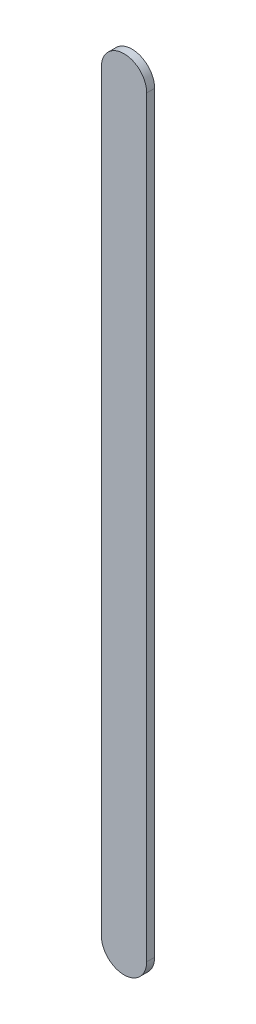
ISO-10303-21;
HEADER;
FILE_DESCRIPTION(('STEP AP214'),'2;1');
FILE_NAME('part.step','',(''),(''),'','','');
FILE_SCHEMA(('AUTOMOTIVE_DESIGN { 1 0 10303 214 1 1 1 1 }'));
ENDSEC;
DATA;
#1=APPLICATION_CONTEXT('core data for automotive mechanical design processes');
#2=APPLICATION_PROTOCOL_DEFINITION('international standard','automotive_design',2000,#1);
#3=PRODUCT_CONTEXT('',#1,'mechanical');
#4=PRODUCT('Part','Part','',(#3));
#5=PRODUCT_RELATED_PRODUCT_CATEGORY('part','',(#4));
#6=PRODUCT_DEFINITION_FORMATION('','',#4);
#7=PRODUCT_DEFINITION_CONTEXT('part definition',#1,'design');
#8=PRODUCT_DEFINITION('design','',#6,#7);
#9=PRODUCT_DEFINITION_SHAPE('','',#8);
#10=(LENGTH_UNIT() NAMED_UNIT(*) SI_UNIT(.MILLI.,.METRE.));
#11=(NAMED_UNIT(*) PLANE_ANGLE_UNIT() SI_UNIT($,.RADIAN.));
#12=(NAMED_UNIT(*) SI_UNIT($,.STERADIAN.) SOLID_ANGLE_UNIT());
#13=UNCERTAINTY_MEASURE_WITH_UNIT(LENGTH_MEASURE(1.E-05),#10,'distance_accuracy_value','');
#14=(GEOMETRIC_REPRESENTATION_CONTEXT(3) GLOBAL_UNCERTAINTY_ASSIGNED_CONTEXT((#13)) GLOBAL_UNIT_ASSIGNED_CONTEXT((#10,
#11,#12)) REPRESENTATION_CONTEXT('',''));
#15=CARTESIAN_POINT('',(0.,0.,0.));
#16=DIRECTION('',(0.,0.,1.));
#17=DIRECTION('',(1.,0.,0.));
#18=AXIS2_PLACEMENT_3D('',#15,#16,#17);
#19=CARTESIAN_POINT('',(93.,-119.905026,1.635));
#20=DIRECTION('',(0.,0.,1.));
#21=DIRECTION('',(1.,0.,0.));
#22=AXIS2_PLACEMENT_3D('',#19,#20,#21);
#23=PLANE('',#22);
#24=DIRECTION('',(0.,-1.,0.));
#25=VECTOR('',#24,1.);
#26=CARTESIAN_POINT('',(93.,-119.905026,1.635));
#27=LINE('',#26,#25);
#28=CARTESIAN_POINT('',(93.,-119.905026,1.635));
#29=VERTEX_POINT('',#28);
#30=CARTESIAN_POINT('',(93.,-123.225127,1.635));
#31=VERTEX_POINT('',#30);
#32=EDGE_CURVE('E79',#29,#31,#27,.T.);
#33=ORIENTED_EDGE('',*,*,#32,.T.);
#34=CARTESIAN_POINT('',(93.1,-123.225127,1.635));
#35=DIRECTION('',(0.,0.,1.));
#36=DIRECTION('',(-1.,-1.42108547152E-13,0.));
#37=AXIS2_PLACEMENT_3D('',#34,#35,#36);
#38=CIRCLE('',#37,0.1);
#39=CARTESIAN_POINT('',(93.2,-123.225127,1.635));
#40=VERTEX_POINT('',#39);
#41=EDGE_CURVE('E97',#31,#40,#38,.T.);
#42=ORIENTED_EDGE('',*,*,#41,.T.);
#43=DIRECTION('',(0.,1.,0.));
#44=VECTOR('',#43,1.);
#45=CARTESIAN_POINT('',(93.2,-123.225127,1.635));
#46=LINE('',#45,#44);
#47=CARTESIAN_POINT('',(93.2,-119.905026,1.635));
#48=VERTEX_POINT('',#47);
#49=EDGE_CURVE('E72',#40,#48,#46,.T.);
#50=ORIENTED_EDGE('',*,*,#49,.T.);
#51=CARTESIAN_POINT('',(93.1,-119.905026,1.635));
#52=DIRECTION('',(0.,0.,1.));
#53=DIRECTION('',(1.,0.,0.));
#54=AXIS2_PLACEMENT_3D('',#51,#52,#53);
#55=CIRCLE('',#54,0.1);
#56=EDGE_CURVE('E11',#48,#29,#55,.T.);
#57=ORIENTED_EDGE('',*,*,#56,.T.);
#58=EDGE_LOOP('',(#33,#42,#50,#57));
#59=FACE_BOUND('',#58,.T.);
#60=ADVANCED_FACE('F17',(#59),#23,.T.);
#61=CARTESIAN_POINT('',(93.,-119.905026,1.6));
#62=DIRECTION('',(0.,0.,1.));
#63=DIRECTION('',(1.,0.,0.));
#64=AXIS2_PLACEMENT_3D('',#61,#62,#63);
#65=PLANE('',#64);
#66=CARTESIAN_POINT('',(93.1,-119.905026,1.6));
#67=DIRECTION('',(0.,0.,1.));
#68=DIRECTION('',(1.,0.,0.));
#69=AXIS2_PLACEMENT_3D('',#66,#67,#68);
#70=CIRCLE('',#69,0.1);
#71=CARTESIAN_POINT('',(93.2,-119.905026,1.6));
#72=VERTEX_POINT('',#71);
#73=CARTESIAN_POINT('',(93.,-119.905026,1.6));
#74=VERTEX_POINT('',#73);
#75=EDGE_CURVE('E26',#72,#74,#70,.T.);
#76=ORIENTED_EDGE('',*,*,#75,.F.);
#77=DIRECTION('',(0.,1.,0.));
#78=VECTOR('',#77,1.);
#79=CARTESIAN_POINT('',(93.2,-123.225127,1.6));
#80=LINE('',#79,#78);
#81=CARTESIAN_POINT('',(93.2,-123.225127,1.6));
#82=VERTEX_POINT('',#81);
#83=EDGE_CURVE('E95',#82,#72,#80,.T.);
#84=ORIENTED_EDGE('',*,*,#83,.F.);
#85=CARTESIAN_POINT('',(93.1,-123.225127,1.6));
#86=DIRECTION('',(0.,0.,1.));
#87=DIRECTION('',(-1.,-1.42108547152E-13,0.));
#88=AXIS2_PLACEMENT_3D('',#85,#86,#87);
#89=CIRCLE('',#88,0.1);
#90=CARTESIAN_POINT('',(93.,-123.225127,1.6));
#91=VERTEX_POINT('',#90);
#92=EDGE_CURVE('E81',#91,#82,#89,.T.);
#93=ORIENTED_EDGE('',*,*,#92,.F.);
#94=DIRECTION('',(0.,-1.,0.));
#95=VECTOR('',#94,1.);
#96=CARTESIAN_POINT('',(93.,-119.905026,1.6));
#97=LINE('',#96,#95);
#98=EDGE_CURVE('E77',#74,#91,#97,.T.);
#99=ORIENTED_EDGE('',*,*,#98,.F.);
#100=EDGE_LOOP('',(#76,#84,#93,#99));
#101=FACE_BOUND('',#100,.T.);
#102=ADVANCED_FACE('F83',(#101),#65,.F.);
#103=CARTESIAN_POINT('',(93.1,-119.905026,1.6));
#104=DIRECTION('',(0.,0.,-1.));
#105=DIRECTION('',(1.,0.,0.));
#106=AXIS2_PLACEMENT_3D('',#103,#104,#105);
#107=CYLINDRICAL_SURFACE('',#106,0.1);
#108=ORIENTED_EDGE('',*,*,#75,.T.);
#109=DIRECTION('',(0.,0.,1.));
#110=VECTOR('',#109,1.);
#111=CARTESIAN_POINT('',(93.,-119.905026,1.6));
#112=LINE('',#111,#110);
#113=EDGE_CURVE('E64',#74,#29,#112,.T.);
#114=ORIENTED_EDGE('',*,*,#113,.T.);
#115=ORIENTED_EDGE('',*,*,#56,.F.);
#116=DIRECTION('',(0.,0.,1.));
#117=VECTOR('',#116,1.);
#118=CARTESIAN_POINT('',(93.2,-119.905026,1.6));
#119=LINE('',#118,#117);
#120=EDGE_CURVE('E67',#72,#48,#119,.T.);
#121=ORIENTED_EDGE('',*,*,#120,.F.);
#122=EDGE_LOOP('',(#108,#114,#115,#121));
#123=FACE_BOUND('',#122,.T.);
#124=ADVANCED_FACE('F63',(#123),#107,.T.);
#125=CARTESIAN_POINT('',(93.2,-123.225127,1.6));
#126=DIRECTION('',(-1.,0.,0.));
#127=DIRECTION('',(0.,0.,1.));
#128=AXIS2_PLACEMENT_3D('',#125,#126,#127);
#129=PLANE('',#128);
#130=ORIENTED_EDGE('',*,*,#83,.T.);
#131=ORIENTED_EDGE('',*,*,#120,.T.);
#132=ORIENTED_EDGE('',*,*,#49,.F.);
#133=DIRECTION('',(0.,0.,1.));
#134=VECTOR('',#133,1.);
#135=CARTESIAN_POINT('',(93.2,-123.225127,1.6));
#136=LINE('',#135,#134);
#137=EDGE_CURVE('E103',#82,#40,#136,.T.);
#138=ORIENTED_EDGE('',*,*,#137,.F.);
#139=EDGE_LOOP('',(#130,#131,#132,#138));
#140=FACE_BOUND('',#139,.T.);
#141=ADVANCED_FACE('F118',(#140),#129,.F.);
#142=CARTESIAN_POINT('',(93.1,-123.225127,1.6));
#143=DIRECTION('',(0.,0.,-1.));
#144=DIRECTION('',(-1.,-1.42108547152E-13,0.));
#145=AXIS2_PLACEMENT_3D('',#142,#143,#144);
#146=CYLINDRICAL_SURFACE('',#145,0.1);
#147=ORIENTED_EDGE('',*,*,#92,.T.);
#148=ORIENTED_EDGE('',*,*,#137,.T.);
#149=ORIENTED_EDGE('',*,*,#41,.F.);
#150=DIRECTION('',(0.,0.,1.));
#151=VECTOR('',#150,1.);
#152=CARTESIAN_POINT('',(93.,-123.225127,1.6));
#153=LINE('',#152,#151);
#154=EDGE_CURVE('E87',#91,#31,#153,.T.);
#155=ORIENTED_EDGE('',*,*,#154,.F.);
#156=EDGE_LOOP('',(#147,#148,#149,#155));
#157=FACE_BOUND('',#156,.T.);
#158=ADVANCED_FACE('F120',(#157),#146,.T.);
#159=CARTESIAN_POINT('',(93.,-119.905026,1.6));
#160=DIRECTION('',(1.,0.,0.));
#161=DIRECTION('',(0.,1.,0.));
#162=AXIS2_PLACEMENT_3D('',#159,#160,#161);
#163=PLANE('',#162);
#164=ORIENTED_EDGE('',*,*,#98,.T.);
#165=ORIENTED_EDGE('',*,*,#154,.T.);
#166=ORIENTED_EDGE('',*,*,#32,.F.);
#167=ORIENTED_EDGE('',*,*,#113,.F.);
#168=EDGE_LOOP('',(#164,#165,#166,#167));
#169=FACE_BOUND('',#168,.T.);
#170=ADVANCED_FACE('F75',(#169),#163,.F.);
#171=CLOSED_SHELL('',(#60,#102,#124,#141,#158,#170));
#172=MANIFOLD_SOLID_BREP('B1',#171);
#173=ADVANCED_BREP_SHAPE_REPRESENTATION('',(#18,#172),#14);
#174=SHAPE_DEFINITION_REPRESENTATION(#9,#173);
ENDSEC;
END-ISO-10303-21;
